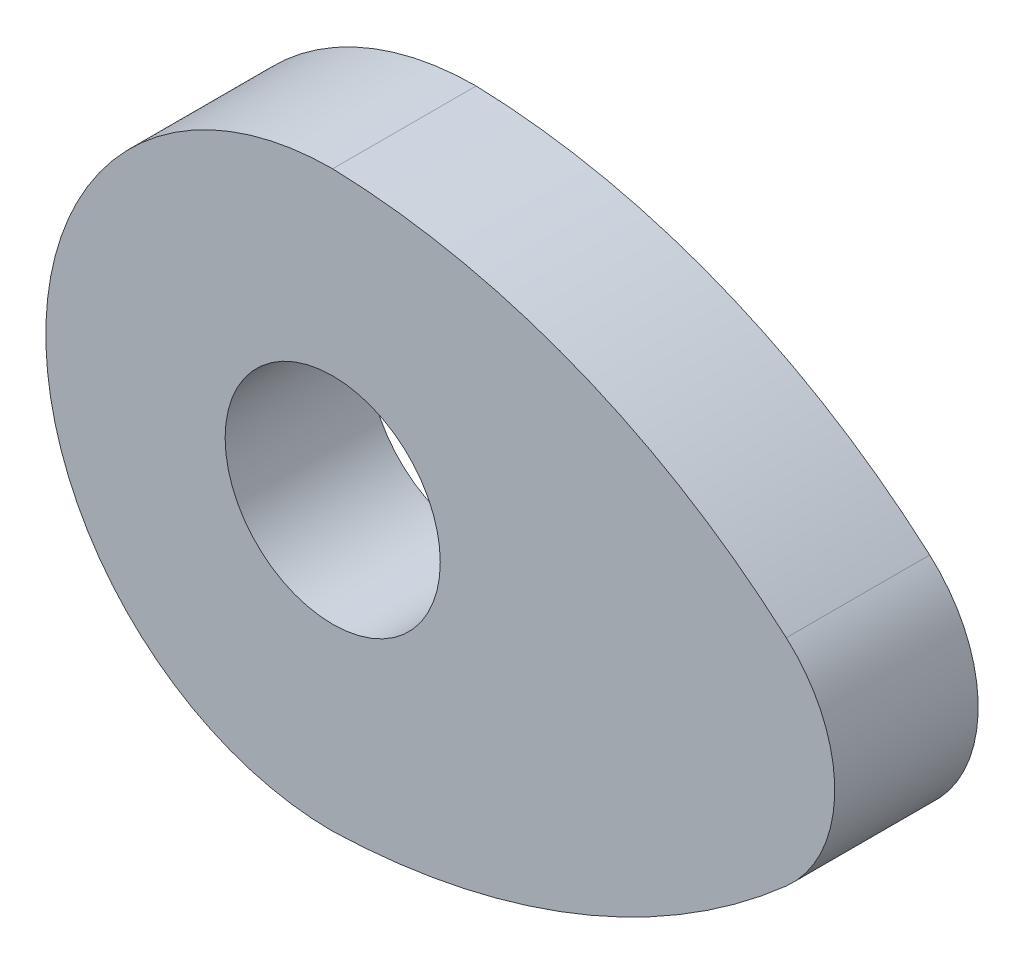
ISO-10303-21;
HEADER;
FILE_DESCRIPTION(('STEP AP214'),'2;1');
FILE_NAME('part.step','',(''),(''),'','','');
FILE_SCHEMA(('AUTOMOTIVE_DESIGN { 1 0 10303 214 1 1 1 1 }'));
ENDSEC;
DATA;
#1=APPLICATION_CONTEXT('core data for automotive mechanical design processes');
#2=APPLICATION_PROTOCOL_DEFINITION('international standard','automotive_design',2000,#1);
#3=PRODUCT_CONTEXT('',#1,'mechanical');
#4=PRODUCT('Part','Part','',(#3));
#5=PRODUCT_RELATED_PRODUCT_CATEGORY('part','',(#4));
#6=PRODUCT_DEFINITION_FORMATION('','',#4);
#7=PRODUCT_DEFINITION_CONTEXT('part definition',#1,'design');
#8=PRODUCT_DEFINITION('design','',#6,#7);
#9=PRODUCT_DEFINITION_SHAPE('','',#8);
#10=(LENGTH_UNIT() NAMED_UNIT(*) SI_UNIT(.MILLI.,.METRE.));
#11=(NAMED_UNIT(*) PLANE_ANGLE_UNIT() SI_UNIT($,.RADIAN.));
#12=(NAMED_UNIT(*) SI_UNIT($,.STERADIAN.) SOLID_ANGLE_UNIT());
#13=UNCERTAINTY_MEASURE_WITH_UNIT(LENGTH_MEASURE(1.E-05),#10,'distance_accuracy_value','');
#14=(GEOMETRIC_REPRESENTATION_CONTEXT(3) GLOBAL_UNCERTAINTY_ASSIGNED_CONTEXT((#13)) GLOBAL_UNIT_ASSIGNED_CONTEXT((#10,
#11,#12)) REPRESENTATION_CONTEXT('',''));
#15=CARTESIAN_POINT('',(0.,0.,0.));
#16=DIRECTION('',(0.,0.,1.));
#17=DIRECTION('',(1.,0.,0.));
#18=AXIS2_PLACEMENT_3D('',#15,#16,#17);
#19=CARTESIAN_POINT('',(0.,0.,5.));
#20=DIRECTION('',(0.,0.,-1.));
#21=DIRECTION('',(-1.,0.,0.));
#22=AXIS2_PLACEMENT_3D('',#19,#20,#21);
#23=CYLINDRICAL_SURFACE('',#22,20.);
#24=CARTESIAN_POINT('',(0.,0.,-5.));
#25=DIRECTION('',(0.,0.,1.));
#26=DIRECTION('',(1.,0.,0.));
#27=AXIS2_PLACEMENT_3D('',#24,#25,#26);
#28=CIRCLE('',#27,20.);
#29=CARTESIAN_POINT('',(5.26922255827955E-13,20.,-5.));
#30=VERTEX_POINT('',#29);
#31=CARTESIAN_POINT('',(5.26922255827955E-13,-20.,-5.));
#32=VERTEX_POINT('',#31);
#33=EDGE_CURVE('E109',#30,#32,#28,.T.);
#34=ORIENTED_EDGE('',*,*,#33,.T.);
#35=DIRECTION('',(0.,0.,-1.));
#36=VECTOR('',#35,1.);
#37=CARTESIAN_POINT('',(5.26922255827955E-13,-20.,5.));
#38=LINE('',#37,#36);
#39=CARTESIAN_POINT('',(5.26922255827955E-13,-20.,5.));
#40=VERTEX_POINT('',#39);
#41=EDGE_CURVE('E11',#40,#32,#38,.T.);
#42=ORIENTED_EDGE('',*,*,#41,.F.);
#43=CARTESIAN_POINT('',(0.,0.,5.));
#44=DIRECTION('',(0.,0.,1.));
#45=DIRECTION('',(1.,0.,0.));
#46=AXIS2_PLACEMENT_3D('',#43,#44,#45);
#47=CIRCLE('',#46,20.);
#48=CARTESIAN_POINT('',(5.26922255827955E-13,20.,5.));
#49=VERTEX_POINT('',#48);
#50=EDGE_CURVE('E91',#49,#40,#47,.T.);
#51=ORIENTED_EDGE('',*,*,#50,.F.);
#52=DIRECTION('',(0.,0.,-1.));
#53=VECTOR('',#52,1.);
#54=CARTESIAN_POINT('',(5.26922255827955E-13,20.,5.));
#55=LINE('',#54,#53);
#56=EDGE_CURVE('E59',#49,#30,#55,.T.);
#57=ORIENTED_EDGE('',*,*,#56,.T.);
#58=EDGE_LOOP('',(#34,#42,#51,#57));
#59=FACE_BOUND('',#58,.T.);
#60=ADVANCED_FACE('F41',(#59),#23,.T.);
#61=CARTESIAN_POINT('',(-1.48241568479795,29.9780196059974,5.));
#62=DIRECTION('',(0.,0.,-1.));
#63=DIRECTION('',(-1.,0.,0.));
#64=AXIS2_PLACEMENT_3D('',#61,#62,#63);
#65=CYLINDRICAL_SURFACE('',#64,50.);
#66=CARTESIAN_POINT('',(-1.48241568479795,29.9780196059974,-5.));
#67=DIRECTION('',(0.,0.,1.));
#68=DIRECTION('',(1.,0.,0.));
#69=AXIS2_PLACEMENT_3D('',#66,#67,#68);
#70=CIRCLE('',#69,50.);
#71=CARTESIAN_POINT('',(31.6206039211995,-7.49450490149937,-5.));
#72=VERTEX_POINT('',#71);
#73=EDGE_CURVE('E96',#32,#72,#70,.T.);
#74=ORIENTED_EDGE('',*,*,#73,.T.);
#75=DIRECTION('',(0.,0.,-1.));
#76=VECTOR('',#75,1.);
#77=CARTESIAN_POINT('',(31.6206039211995,-7.49450490149937,5.));
#78=LINE('',#77,#76);
#79=CARTESIAN_POINT('',(31.6206039211995,-7.49450490149937,5.));
#80=VERTEX_POINT('',#79);
#81=EDGE_CURVE('E49',#80,#72,#78,.T.);
#82=ORIENTED_EDGE('',*,*,#81,.F.);
#83=CARTESIAN_POINT('',(-1.48241568479795,29.9780196059974,5.));
#84=DIRECTION('',(0.,0.,1.));
#85=DIRECTION('',(1.,0.,0.));
#86=AXIS2_PLACEMENT_3D('',#83,#84,#85);
#87=CIRCLE('',#86,50.);
#88=EDGE_CURVE('E84',#40,#80,#87,.T.);
#89=ORIENTED_EDGE('',*,*,#88,.F.);
#90=ORIENTED_EDGE('',*,*,#41,.T.);
#91=EDGE_LOOP('',(#74,#82,#89,#90));
#92=FACE_BOUND('',#91,.T.);
#93=ADVANCED_FACE('F94',(#92),#65,.T.);
#94=CARTESIAN_POINT('',(25.,0.,5.));
#95=DIRECTION('',(0.,0.,-1.));
#96=DIRECTION('',(-1.,0.,0.));
#97=AXIS2_PLACEMENT_3D('',#94,#95,#96);
#98=CYLINDRICAL_SURFACE('',#97,10.);
#99=CARTESIAN_POINT('',(25.,0.,-5.));
#100=DIRECTION('',(0.,0.,1.));
#101=DIRECTION('',(1.,0.,0.));
#102=AXIS2_PLACEMENT_3D('',#99,#100,#101);
#103=CIRCLE('',#102,10.);
#104=CARTESIAN_POINT('',(31.6206039211995,7.49450490149937,-5.));
#105=VERTEX_POINT('',#104);
#106=EDGE_CURVE('E112',#72,#105,#103,.T.);
#107=ORIENTED_EDGE('',*,*,#106,.T.);
#108=DIRECTION('',(0.,0.,-1.));
#109=VECTOR('',#108,1.);
#110=CARTESIAN_POINT('',(31.6206039211995,7.49450490149937,5.));
#111=LINE('',#110,#109);
#112=CARTESIAN_POINT('',(31.6206039211995,7.49450490149937,5.));
#113=VERTEX_POINT('',#112);
#114=EDGE_CURVE('E74',#113,#105,#111,.T.);
#115=ORIENTED_EDGE('',*,*,#114,.F.);
#116=CARTESIAN_POINT('',(25.,0.,5.));
#117=DIRECTION('',(0.,0.,1.));
#118=DIRECTION('',(1.,0.,0.));
#119=AXIS2_PLACEMENT_3D('',#116,#117,#118);
#120=CIRCLE('',#119,10.);
#121=EDGE_CURVE('E89',#80,#113,#120,.T.);
#122=ORIENTED_EDGE('',*,*,#121,.F.);
#123=ORIENTED_EDGE('',*,*,#81,.T.);
#124=EDGE_LOOP('',(#107,#115,#122,#123));
#125=FACE_BOUND('',#124,.T.);
#126=ADVANCED_FACE('F98',(#125),#98,.T.);
#127=CARTESIAN_POINT('',(0.,0.,5.));
#128=DIRECTION('',(0.,0.,-1.));
#129=DIRECTION('',(-1.,0.,0.));
#130=AXIS2_PLACEMENT_3D('',#127,#128,#129);
#131=CYLINDRICAL_SURFACE('',#130,7.5);
#132=CARTESIAN_POINT('',(0.,0.,5.));
#133=DIRECTION('',(0.,0.,1.));
#134=DIRECTION('',(1.,0.,0.));
#135=AXIS2_PLACEMENT_3D('',#132,#133,#134);
#136=CIRCLE('',#135,7.5);
#137=CARTESIAN_POINT('',(7.5,0.,5.));
#138=VERTEX_POINT('',#137);
#139=EDGE_CURVE('E116',#138,#138,#136,.T.);
#140=ORIENTED_EDGE('',*,*,#139,.T.);
#141=EDGE_LOOP('',(#140));
#142=FACE_BOUND('',#141,.T.);
#143=CARTESIAN_POINT('',(0.,0.,-5.));
#144=DIRECTION('',(0.,0.,1.));
#145=DIRECTION('',(1.,0.,0.));
#146=AXIS2_PLACEMENT_3D('',#143,#144,#145);
#147=CIRCLE('',#146,7.5);
#148=CARTESIAN_POINT('',(7.5,0.,-5.));
#149=VERTEX_POINT('',#148);
#150=EDGE_CURVE('E103',#149,#149,#147,.T.);
#151=ORIENTED_EDGE('',*,*,#150,.F.);
#152=EDGE_LOOP('',(#151));
#153=FACE_BOUND('',#152,.T.);
#154=ADVANCED_FACE('F43',(#142,#153),#131,.F.);
#155=CARTESIAN_POINT('',(-1.48241568479795,-29.9780196059974,5.));
#156=DIRECTION('',(0.,0.,-1.));
#157=DIRECTION('',(-1.,0.,0.));
#158=AXIS2_PLACEMENT_3D('',#155,#156,#157);
#159=CYLINDRICAL_SURFACE('',#158,50.);
#160=CARTESIAN_POINT('',(-1.48241568479795,-29.9780196059974,-5.));
#161=DIRECTION('',(0.,0.,1.));
#162=DIRECTION('',(1.,0.,0.));
#163=AXIS2_PLACEMENT_3D('',#160,#161,#162);
#164=CIRCLE('',#163,50.);
#165=EDGE_CURVE('E111',#30,#105,#164,.F.);
#166=ORIENTED_EDGE('',*,*,#165,.F.);
#167=ORIENTED_EDGE('',*,*,#56,.F.);
#168=CARTESIAN_POINT('',(-1.48241568479795,-29.9780196059974,5.));
#169=DIRECTION('',(0.,0.,1.));
#170=DIRECTION('',(1.,0.,0.));
#171=AXIS2_PLACEMENT_3D('',#168,#169,#170);
#172=CIRCLE('',#171,50.);
#173=EDGE_CURVE('E99',#49,#113,#172,.F.);
#174=ORIENTED_EDGE('',*,*,#173,.T.);
#175=ORIENTED_EDGE('',*,*,#114,.T.);
#176=EDGE_LOOP('',(#166,#167,#174,#175));
#177=FACE_BOUND('',#176,.T.);
#178=ADVANCED_FACE('F130',(#177),#159,.T.);
#179=CARTESIAN_POINT('',(0.,0.,5.));
#180=DIRECTION('',(0.,0.,1.));
#181=DIRECTION('',(1.,0.,0.));
#182=AXIS2_PLACEMENT_3D('',#179,#180,#181);
#183=PLANE('',#182);
#184=ORIENTED_EDGE('',*,*,#139,.F.);
#185=EDGE_LOOP('',(#184));
#186=FACE_BOUND('',#185,.T.);
#187=ORIENTED_EDGE('',*,*,#50,.T.);
#188=ORIENTED_EDGE('',*,*,#88,.T.);
#189=ORIENTED_EDGE('',*,*,#121,.T.);
#190=ORIENTED_EDGE('',*,*,#173,.F.);
#191=EDGE_LOOP('',(#187,#188,#189,#190));
#192=FACE_BOUND('',#191,.T.);
#193=ADVANCED_FACE('F90',(#186,#192),#183,.T.);
#194=CARTESIAN_POINT('',(0.,0.,-5.));
#195=DIRECTION('',(0.,0.,1.));
#196=DIRECTION('',(1.,0.,0.));
#197=AXIS2_PLACEMENT_3D('',#194,#195,#196);
#198=PLANE('',#197);
#199=ORIENTED_EDGE('',*,*,#150,.T.);
#200=EDGE_LOOP('',(#199));
#201=FACE_BOUND('',#200,.T.);
#202=ORIENTED_EDGE('',*,*,#33,.F.);
#203=ORIENTED_EDGE('',*,*,#165,.T.);
#204=ORIENTED_EDGE('',*,*,#106,.F.);
#205=ORIENTED_EDGE('',*,*,#73,.F.);
#206=EDGE_LOOP('',(#202,#203,#204,#205));
#207=FACE_BOUND('',#206,.T.);
#208=ADVANCED_FACE('F128',(#201,#207),#198,.F.);
#209=CLOSED_SHELL('',(#60,#93,#126,#154,#178,#193,#208));
#210=MANIFOLD_SOLID_BREP('B2',#209);
#211=ADVANCED_BREP_SHAPE_REPRESENTATION('',(#18,#210),#14);
#212=SHAPE_DEFINITION_REPRESENTATION(#9,#211);
ENDSEC;
END-ISO-10303-21;
